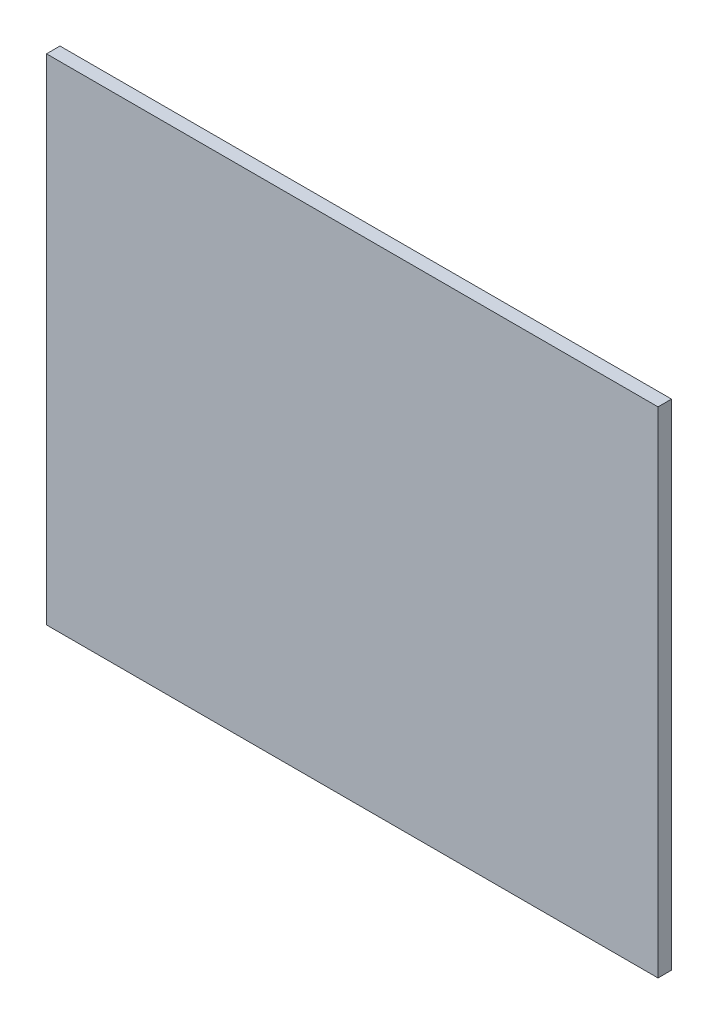
ISO-10303-21;
HEADER;
FILE_DESCRIPTION(('STEP AP214'),'2;1');
FILE_NAME('part.step','',(''),(''),'','','');
FILE_SCHEMA(('AUTOMOTIVE_DESIGN { 1 0 10303 214 1 1 1 1 }'));
ENDSEC;
DATA;
#1=APPLICATION_CONTEXT('core data for automotive mechanical design processes');
#2=APPLICATION_PROTOCOL_DEFINITION('international standard','automotive_design',2000,#1);
#3=PRODUCT_CONTEXT('',#1,'mechanical');
#4=PRODUCT('Part','Part','',(#3));
#5=PRODUCT_RELATED_PRODUCT_CATEGORY('part','',(#4));
#6=PRODUCT_DEFINITION_FORMATION('','',#4);
#7=PRODUCT_DEFINITION_CONTEXT('part definition',#1,'design');
#8=PRODUCT_DEFINITION('design','',#6,#7);
#9=PRODUCT_DEFINITION_SHAPE('','',#8);
#10=(LENGTH_UNIT() NAMED_UNIT(*) SI_UNIT(.MILLI.,.METRE.));
#11=(NAMED_UNIT(*) PLANE_ANGLE_UNIT() SI_UNIT($,.RADIAN.));
#12=(NAMED_UNIT(*) SI_UNIT($,.STERADIAN.) SOLID_ANGLE_UNIT());
#13=UNCERTAINTY_MEASURE_WITH_UNIT(LENGTH_MEASURE(1.E-05),#10,'distance_accuracy_value','');
#14=(GEOMETRIC_REPRESENTATION_CONTEXT(3) GLOBAL_UNCERTAINTY_ASSIGNED_CONTEXT((#13)) GLOBAL_UNIT_ASSIGNED_CONTEXT((#10,
#11,#12)) REPRESENTATION_CONTEXT('',''));
#15=CARTESIAN_POINT('',(0.,0.,0.));
#16=DIRECTION('',(0.,0.,1.));
#17=DIRECTION('',(1.,0.,0.));
#18=AXIS2_PLACEMENT_3D('',#15,#16,#17);
#19=CARTESIAN_POINT('',(-68.,55.,3.));
#20=DIRECTION('',(0.,1.,0.));
#21=DIRECTION('',(0.,0.,1.));
#22=AXIS2_PLACEMENT_3D('',#19,#20,#21);
#23=PLANE('',#22);
#24=DIRECTION('',(1.,0.,0.));
#25=VECTOR('',#24,1.);
#26=CARTESIAN_POINT('',(-68.,55.,0.));
#27=LINE('',#26,#25);
#28=CARTESIAN_POINT('',(-68.,55.,0.));
#29=VERTEX_POINT('',#28);
#30=CARTESIAN_POINT('',(68.,55.,0.));
#31=VERTEX_POINT('',#30);
#32=EDGE_CURVE('E99',#29,#31,#27,.T.);
#33=ORIENTED_EDGE('',*,*,#32,.F.);
#34=DIRECTION('',(0.,0.,-1.));
#35=VECTOR('',#34,1.);
#36=CARTESIAN_POINT('',(-68.,55.,3.));
#37=LINE('',#36,#35);
#38=CARTESIAN_POINT('',(-68.,55.,3.));
#39=VERTEX_POINT('',#38);
#40=EDGE_CURVE('E11',#39,#29,#37,.T.);
#41=ORIENTED_EDGE('',*,*,#40,.F.);
#42=DIRECTION('',(1.,0.,0.));
#43=VECTOR('',#42,1.);
#44=CARTESIAN_POINT('',(-68.,55.,3.));
#45=LINE('',#44,#43);
#46=CARTESIAN_POINT('',(68.,55.,3.));
#47=VERTEX_POINT('',#46);
#48=EDGE_CURVE('E94',#39,#47,#45,.T.);
#49=ORIENTED_EDGE('',*,*,#48,.T.);
#50=DIRECTION('',(0.,0.,-1.));
#51=VECTOR('',#50,1.);
#52=CARTESIAN_POINT('',(68.,55.,3.));
#53=LINE('',#52,#51);
#54=EDGE_CURVE('E37',#47,#31,#53,.T.);
#55=ORIENTED_EDGE('',*,*,#54,.T.);
#56=EDGE_LOOP('',(#33,#41,#49,#55));
#57=FACE_BOUND('',#56,.T.);
#58=ADVANCED_FACE('F34',(#57),#23,.T.);
#59=CARTESIAN_POINT('',(-68.,55.,3.));
#60=DIRECTION('',(1.,0.,0.));
#61=DIRECTION('',(0.,1.,0.));
#62=AXIS2_PLACEMENT_3D('',#59,#60,#61);
#63=PLANE('',#62);
#64=DIRECTION('',(0.,-1.,0.));
#65=VECTOR('',#64,1.);
#66=CARTESIAN_POINT('',(-68.,55.,0.));
#67=LINE('',#66,#65);
#68=CARTESIAN_POINT('',(-68.,-55.,0.));
#69=VERTEX_POINT('',#68);
#70=EDGE_CURVE('E67',#29,#69,#67,.T.);
#71=ORIENTED_EDGE('',*,*,#70,.T.);
#72=DIRECTION('',(0.,0.,-1.));
#73=VECTOR('',#72,1.);
#74=CARTESIAN_POINT('',(-68.,-55.,3.));
#75=LINE('',#74,#73);
#76=CARTESIAN_POINT('',(-68.,-55.,3.));
#77=VERTEX_POINT('',#76);
#78=EDGE_CURVE('E43',#77,#69,#75,.T.);
#79=ORIENTED_EDGE('',*,*,#78,.F.);
#80=DIRECTION('',(0.,-1.,0.));
#81=VECTOR('',#80,1.);
#82=CARTESIAN_POINT('',(-68.,55.,3.));
#83=LINE('',#82,#81);
#84=EDGE_CURVE('E84',#39,#77,#83,.T.);
#85=ORIENTED_EDGE('',*,*,#84,.F.);
#86=ORIENTED_EDGE('',*,*,#40,.T.);
#87=EDGE_LOOP('',(#71,#79,#85,#86));
#88=FACE_BOUND('',#87,.T.);
#89=ADVANCED_FACE('F109',(#88),#63,.F.);
#90=CARTESIAN_POINT('',(-68.,-55.,3.));
#91=DIRECTION('',(0.,1.,0.));
#92=DIRECTION('',(0.,0.,1.));
#93=AXIS2_PLACEMENT_3D('',#90,#91,#92);
#94=PLANE('',#93);
#95=DIRECTION('',(1.,0.,0.));
#96=VECTOR('',#95,1.);
#97=CARTESIAN_POINT('',(-68.,-55.,0.));
#98=LINE('',#97,#96);
#99=CARTESIAN_POINT('',(68.,-55.,0.));
#100=VERTEX_POINT('',#99);
#101=EDGE_CURVE('E91',#69,#100,#98,.T.);
#102=ORIENTED_EDGE('',*,*,#101,.T.);
#103=DIRECTION('',(0.,0.,-1.));
#104=VECTOR('',#103,1.);
#105=CARTESIAN_POINT('',(68.,-55.,3.));
#106=LINE('',#105,#104);
#107=CARTESIAN_POINT('',(68.,-55.,3.));
#108=VERTEX_POINT('',#107);
#109=EDGE_CURVE('E88',#108,#100,#106,.T.);
#110=ORIENTED_EDGE('',*,*,#109,.F.);
#111=DIRECTION('',(1.,0.,0.));
#112=VECTOR('',#111,1.);
#113=CARTESIAN_POINT('',(-68.,-55.,3.));
#114=LINE('',#113,#112);
#115=EDGE_CURVE('E79',#77,#108,#114,.T.);
#116=ORIENTED_EDGE('',*,*,#115,.F.);
#117=ORIENTED_EDGE('',*,*,#78,.T.);
#118=EDGE_LOOP('',(#102,#110,#116,#117));
#119=FACE_BOUND('',#118,.T.);
#120=ADVANCED_FACE('F89',(#119),#94,.F.);
#121=CARTESIAN_POINT('',(68.,55.,3.));
#122=DIRECTION('',(1.,0.,0.));
#123=DIRECTION('',(0.,1.,0.));
#124=AXIS2_PLACEMENT_3D('',#121,#122,#123);
#125=PLANE('',#124);
#126=DIRECTION('',(0.,-1.,0.));
#127=VECTOR('',#126,1.);
#128=CARTESIAN_POINT('',(68.,55.,0.));
#129=LINE('',#128,#127);
#130=EDGE_CURVE('E102',#31,#100,#129,.T.);
#131=ORIENTED_EDGE('',*,*,#130,.F.);
#132=ORIENTED_EDGE('',*,*,#54,.F.);
#133=DIRECTION('',(0.,-1.,0.));
#134=VECTOR('',#133,1.);
#135=CARTESIAN_POINT('',(68.,55.,3.));
#136=LINE('',#135,#134);
#137=EDGE_CURVE('E83',#47,#108,#136,.T.);
#138=ORIENTED_EDGE('',*,*,#137,.T.);
#139=ORIENTED_EDGE('',*,*,#109,.T.);
#140=EDGE_LOOP('',(#131,#132,#138,#139));
#141=FACE_BOUND('',#140,.T.);
#142=ADVANCED_FACE('F93',(#141),#125,.T.);
#143=CARTESIAN_POINT('',(0.,0.,3.));
#144=DIRECTION('',(0.,0.,-1.));
#145=DIRECTION('',(-1.,0.,0.));
#146=AXIS2_PLACEMENT_3D('',#143,#144,#145);
#147=PLANE('',#146);
#148=ORIENTED_EDGE('',*,*,#48,.F.);
#149=ORIENTED_EDGE('',*,*,#84,.T.);
#150=ORIENTED_EDGE('',*,*,#115,.T.);
#151=ORIENTED_EDGE('',*,*,#137,.F.);
#152=EDGE_LOOP('',(#148,#149,#150,#151));
#153=FACE_BOUND('',#152,.T.);
#154=ADVANCED_FACE('F82',(#153),#147,.F.);
#155=CARTESIAN_POINT('',(0.,0.,0.));
#156=DIRECTION('',(0.,0.,-1.));
#157=DIRECTION('',(-1.,0.,0.));
#158=AXIS2_PLACEMENT_3D('',#155,#156,#157);
#159=PLANE('',#158);
#160=ORIENTED_EDGE('',*,*,#32,.T.);
#161=ORIENTED_EDGE('',*,*,#130,.T.);
#162=ORIENTED_EDGE('',*,*,#101,.F.);
#163=ORIENTED_EDGE('',*,*,#70,.F.);
#164=EDGE_LOOP('',(#160,#161,#162,#163));
#165=FACE_BOUND('',#164,.T.);
#166=ADVANCED_FACE('F107',(#165),#159,.T.);
#167=CLOSED_SHELL('',(#58,#89,#120,#142,#154,#166));
#168=MANIFOLD_SOLID_BREP('B2',#167);
#169=ADVANCED_BREP_SHAPE_REPRESENTATION('',(#18,#168),#14);
#170=SHAPE_DEFINITION_REPRESENTATION(#9,#169);
ENDSEC;
END-ISO-10303-21;
